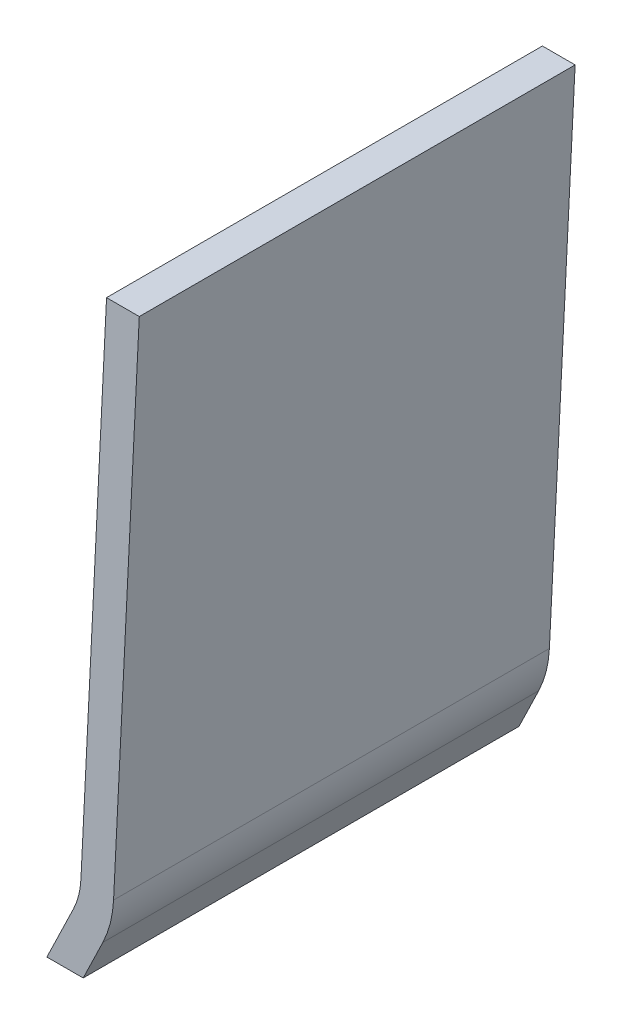
ISO-10303-21;
HEADER;
FILE_DESCRIPTION(('STEP AP214'),'2;1');
FILE_NAME('part.step','',(''),(''),'','','');
FILE_SCHEMA(('AUTOMOTIVE_DESIGN { 1 0 10303 214 1 1 1 1 }'));
ENDSEC;
DATA;
#1=APPLICATION_CONTEXT('core data for automotive mechanical design processes');
#2=APPLICATION_PROTOCOL_DEFINITION('international standard','automotive_design',2000,#1);
#3=PRODUCT_CONTEXT('',#1,'mechanical');
#4=PRODUCT('Part','Part','',(#3));
#5=PRODUCT_RELATED_PRODUCT_CATEGORY('part','',(#4));
#6=PRODUCT_DEFINITION_FORMATION('','',#4);
#7=PRODUCT_DEFINITION_CONTEXT('part definition',#1,'design');
#8=PRODUCT_DEFINITION('design','',#6,#7);
#9=PRODUCT_DEFINITION_SHAPE('','',#8);
#10=(LENGTH_UNIT() NAMED_UNIT(*) SI_UNIT(.MILLI.,.METRE.));
#11=(NAMED_UNIT(*) PLANE_ANGLE_UNIT() SI_UNIT($,.RADIAN.));
#12=(NAMED_UNIT(*) SI_UNIT($,.STERADIAN.) SOLID_ANGLE_UNIT());
#13=UNCERTAINTY_MEASURE_WITH_UNIT(LENGTH_MEASURE(1.E-05),#10,'distance_accuracy_value','');
#14=(GEOMETRIC_REPRESENTATION_CONTEXT(3) GLOBAL_UNCERTAINTY_ASSIGNED_CONTEXT((#13)) GLOBAL_UNIT_ASSIGNED_CONTEXT((#10,
#11,#12)) REPRESENTATION_CONTEXT('',''));
#15=CARTESIAN_POINT('',(0.,0.,0.));
#16=DIRECTION('',(0.,0.,1.));
#17=DIRECTION('',(1.,0.,0.));
#18=AXIS2_PLACEMENT_3D('',#15,#16,#17);
#19=CARTESIAN_POINT('',(537.24518068238,75.8749544468585,400.));
#20=DIRECTION('',(-0.998771350761454,0.0495559168832607,0.));
#21=DIRECTION('',(-0.0495559168832607,-0.998771350761454,0.));
#22=AXIS2_PLACEMENT_3D('',#19,#20,#21);
#23=PLANE('',#22);
#24=DIRECTION('',(0.0495559168832607,0.998771350761454,0.));
#25=VECTOR('',#24,1.);
#26=CARTESIAN_POINT('',(537.24518068238,75.8749544468585,0.));
#27=LINE('',#26,#25);
#28=CARTESIAN_POINT('',(537.24518068238,75.8749544468585,0.));
#29=VERTEX_POINT('',#28);
#30=CARTESIAN_POINT('',(560.843549817296,551.486677506498,0.));
#31=VERTEX_POINT('',#30);
#32=EDGE_CURVE('E140',#29,#31,#27,.T.);
#33=ORIENTED_EDGE('',*,*,#32,.T.);
#34=DIRECTION('',(0.,0.,-1.));
#35=VECTOR('',#34,1.);
#36=CARTESIAN_POINT('',(560.843549817296,551.486677506498,400.));
#37=LINE('',#36,#35);
#38=CARTESIAN_POINT('',(560.843549817296,551.486677506498,400.));
#39=VERTEX_POINT('',#38);
#40=EDGE_CURVE('E11',#39,#31,#37,.T.);
#41=ORIENTED_EDGE('',*,*,#40,.F.);
#42=DIRECTION('',(0.0495559168832607,0.998771350761454,0.));
#43=VECTOR('',#42,1.);
#44=CARTESIAN_POINT('',(537.24518068238,75.8749544468585,400.));
#45=LINE('',#44,#43);
#46=CARTESIAN_POINT('',(537.24518068238,75.8749544468585,400.));
#47=VERTEX_POINT('',#46);
#48=EDGE_CURVE('E162',#47,#39,#45,.T.);
#49=ORIENTED_EDGE('',*,*,#48,.F.);
#50=DIRECTION('',(0.,0.,-1.));
#51=VECTOR('',#50,1.);
#52=CARTESIAN_POINT('',(537.24518068238,75.8749544468585,400.));
#53=LINE('',#52,#51);
#54=EDGE_CURVE('E136',#47,#29,#53,.T.);
#55=ORIENTED_EDGE('',*,*,#54,.T.);
#56=EDGE_LOOP('',(#33,#41,#49,#55));
#57=FACE_BOUND('',#56,.T.);
#58=ADVANCED_FACE('F39',(#57),#23,.F.);
#59=CARTESIAN_POINT('',(530.80664499706,551.486677506498,400.));
#60=DIRECTION('',(0.,-1.,0.));
#61=DIRECTION('',(0.,0.,-1.));
#62=AXIS2_PLACEMENT_3D('',#59,#60,#61);
#63=PLANE('',#62);
#64=DIRECTION('',(-1.,0.,0.));
#65=VECTOR('',#64,1.);
#66=CARTESIAN_POINT('',(530.80664499706,551.486677506498,0.));
#67=LINE('',#66,#65);
#68=CARTESIAN_POINT('',(530.80664499706,551.486677506498,0.));
#69=VERTEX_POINT('',#68);
#70=EDGE_CURVE('E144',#31,#69,#67,.T.);
#71=ORIENTED_EDGE('',*,*,#70,.T.);
#72=DIRECTION('',(0.,0.,-1.));
#73=VECTOR('',#72,1.);
#74=CARTESIAN_POINT('',(530.80664499706,551.486677506498,400.));
#75=LINE('',#74,#73);
#76=CARTESIAN_POINT('',(530.80664499706,551.486677506498,400.));
#77=VERTEX_POINT('',#76);
#78=EDGE_CURVE('E48',#77,#69,#75,.T.);
#79=ORIENTED_EDGE('',*,*,#78,.F.);
#80=DIRECTION('',(-1.,0.,0.));
#81=VECTOR('',#80,1.);
#82=CARTESIAN_POINT('',(530.80664499706,551.486677506498,400.));
#83=LINE('',#82,#81);
#84=EDGE_CURVE('E99',#39,#77,#83,.T.);
#85=ORIENTED_EDGE('',*,*,#84,.F.);
#86=ORIENTED_EDGE('',*,*,#40,.T.);
#87=EDGE_LOOP('',(#71,#79,#85,#86));
#88=FACE_BOUND('',#87,.T.);
#89=ADVANCED_FACE('F208',(#88),#63,.F.);
#90=CARTESIAN_POINT('',(507.282040159536,77.3616319533563,400.));
#91=DIRECTION('',(0.998771350761454,-0.0495559168832607,0.));
#92=DIRECTION('',(0.0495559168832607,0.998771350761454,0.));
#93=AXIS2_PLACEMENT_3D('',#90,#91,#92);
#94=PLANE('',#93);
#95=DIRECTION('',(-0.0495559168832607,-0.998771350761454,0.));
#96=VECTOR('',#95,1.);
#97=CARTESIAN_POINT('',(507.282040159536,77.3616319533563,0.));
#98=LINE('',#97,#96);
#99=CARTESIAN_POINT('',(507.282040159536,77.3616319533563,0.));
#100=VERTEX_POINT('',#99);
#101=EDGE_CURVE('E147',#69,#100,#98,.T.);
#102=ORIENTED_EDGE('',*,*,#101,.T.);
#103=DIRECTION('',(0.,0.,-1.));
#104=VECTOR('',#103,1.);
#105=CARTESIAN_POINT('',(507.282040159536,77.3616319533563,400.));
#106=LINE('',#105,#104);
#107=CARTESIAN_POINT('',(507.282040159536,77.3616319533563,400.));
#108=VERTEX_POINT('',#107);
#109=EDGE_CURVE('E173',#108,#100,#106,.T.);
#110=ORIENTED_EDGE('',*,*,#109,.F.);
#111=DIRECTION('',(-0.0495559168832607,-0.998771350761454,0.));
#112=VECTOR('',#111,1.);
#113=CARTESIAN_POINT('',(507.282040159536,77.3616319533563,400.));
#114=LINE('',#113,#112);
#115=EDGE_CURVE('E183',#77,#108,#114,.T.);
#116=ORIENTED_EDGE('',*,*,#115,.F.);
#117=ORIENTED_EDGE('',*,*,#78,.T.);
#118=EDGE_LOOP('',(#102,#110,#116,#117));
#119=FACE_BOUND('',#118,.T.);
#120=ADVANCED_FACE('F181',(#119),#94,.F.);
#121=CARTESIAN_POINT('',(437.368045606234,80.8305461351842,400.));
#122=DIRECTION('',(0.,0.,-1.));
#123=DIRECTION('',(-1.,0.,0.));
#124=AXIS2_PLACEMENT_3D('',#121,#122,#123);
#125=CYLINDRICAL_SURFACE('',#124,70.);
#126=CARTESIAN_POINT('',(437.368045606234,80.8305461351842,0.));
#127=DIRECTION('',(0.,0.,-1.));
#128=DIRECTION('',(1.,0.,0.));
#129=AXIS2_PLACEMENT_3D('',#126,#127,#128);
#130=CIRCLE('',#129,70.);
#131=CARTESIAN_POINT('',(500.387814031148,50.3591039692765,0.));
#132=VERTEX_POINT('',#131);
#133=EDGE_CURVE('E150',#100,#132,#130,.T.);
#134=ORIENTED_EDGE('',*,*,#133,.T.);
#135=DIRECTION('',(0.,0.,-1.));
#136=VECTOR('',#135,1.);
#137=CARTESIAN_POINT('',(500.387814031148,50.3591039692765,400.));
#138=LINE('',#137,#136);
#139=CARTESIAN_POINT('',(500.387814031148,50.3591039692765,400.));
#140=VERTEX_POINT('',#139);
#141=EDGE_CURVE('E169',#140,#132,#138,.T.);
#142=ORIENTED_EDGE('',*,*,#141,.F.);
#143=CARTESIAN_POINT('',(437.368045606234,80.8305461351842,400.));
#144=DIRECTION('',(0.,0.,-1.));
#145=DIRECTION('',(1.,0.,0.));
#146=AXIS2_PLACEMENT_3D('',#143,#144,#145);
#147=CIRCLE('',#146,70.);
#148=EDGE_CURVE('E196',#108,#140,#147,.T.);
#149=ORIENTED_EDGE('',*,*,#148,.F.);
#150=ORIENTED_EDGE('',*,*,#109,.T.);
#151=EDGE_LOOP('',(#134,#142,#149,#150));
#152=FACE_BOUND('',#151,.T.);
#153=ADVANCED_FACE('F191',(#152),#125,.F.);
#154=CARTESIAN_POINT('',(500.387814031148,50.3591039692764,400.));
#155=DIRECTION('',(0.900282406070196,-0.435306316655821,0.));
#156=DIRECTION('',(0.435306316655821,0.900282406070196,0.));
#157=AXIS2_PLACEMENT_3D('',#154,#155,#156);
#158=PLANE('',#157);
#159=DIRECTION('',(-0.435306316655821,-0.900282406070196,0.));
#160=VECTOR('',#159,1.);
#161=CARTESIAN_POINT('',(500.387814031148,50.3591039692764,0.));
#162=LINE('',#161,#160);
#163=CARTESIAN_POINT('',(476.038081201598,0.,0.));
#164=VERTEX_POINT('',#163);
#165=EDGE_CURVE('E153',#132,#164,#162,.T.);
#166=ORIENTED_EDGE('',*,*,#165,.T.);
#167=DIRECTION('',(0.,0.,-1.));
#168=VECTOR('',#167,1.);
#169=CARTESIAN_POINT('',(476.038081201598,0.,400.));
#170=LINE('',#169,#168);
#171=CARTESIAN_POINT('',(476.038081201598,0.,400.));
#172=VERTEX_POINT('',#171);
#173=EDGE_CURVE('E129',#172,#164,#170,.T.);
#174=ORIENTED_EDGE('',*,*,#173,.F.);
#175=DIRECTION('',(-0.435306316655821,-0.900282406070196,0.));
#176=VECTOR('',#175,1.);
#177=CARTESIAN_POINT('',(500.387814031148,50.3591039692764,400.));
#178=LINE('',#177,#176);
#179=EDGE_CURVE('E118',#140,#172,#178,.T.);
#180=ORIENTED_EDGE('',*,*,#179,.F.);
#181=ORIENTED_EDGE('',*,*,#141,.T.);
#182=EDGE_LOOP('',(#166,#174,#180,#181));
#183=FACE_BOUND('',#182,.T.);
#184=ADVANCED_FACE('F194',(#183),#158,.F.);
#185=CARTESIAN_POINT('',(476.038081201598,0.,400.));
#186=DIRECTION('',(0.,1.,0.));
#187=DIRECTION('',(0.,0.,1.));
#188=AXIS2_PLACEMENT_3D('',#185,#186,#187);
#189=PLANE('',#188);
#190=DIRECTION('',(1.,0.,0.));
#191=VECTOR('',#190,1.);
#192=CARTESIAN_POINT('',(476.038081201598,0.,0.));
#193=LINE('',#192,#191);
#194=CARTESIAN_POINT('',(509.360958331845,0.,0.));
#195=VERTEX_POINT('',#194);
#196=EDGE_CURVE('E127',#164,#195,#193,.T.);
#197=ORIENTED_EDGE('',*,*,#196,.T.);
#198=DIRECTION('',(0.,0.,-1.));
#199=VECTOR('',#198,1.);
#200=CARTESIAN_POINT('',(509.360958331845,0.,400.));
#201=LINE('',#200,#199);
#202=CARTESIAN_POINT('',(509.360958331845,0.,400.));
#203=VERTEX_POINT('',#202);
#204=EDGE_CURVE('E124',#203,#195,#201,.T.);
#205=ORIENTED_EDGE('',*,*,#204,.F.);
#206=DIRECTION('',(1.,0.,0.));
#207=VECTOR('',#206,1.);
#208=CARTESIAN_POINT('',(476.038081201598,0.,400.));
#209=LINE('',#208,#207);
#210=EDGE_CURVE('E112',#172,#203,#209,.T.);
#211=ORIENTED_EDGE('',*,*,#210,.F.);
#212=ORIENTED_EDGE('',*,*,#173,.T.);
#213=EDGE_LOOP('',(#197,#205,#211,#212));
#214=FACE_BOUND('',#213,.T.);
#215=ADVANCED_FACE('F125',(#214),#189,.F.);
#216=CARTESIAN_POINT('',(509.360958331845,0.,400.));
#217=DIRECTION('',(-0.900282406070196,0.435306316655821,0.));
#218=DIRECTION('',(-0.435306316655821,-0.900282406070196,0.));
#219=AXIS2_PLACEMENT_3D('',#216,#217,#218);
#220=PLANE('',#219);
#221=DIRECTION('',(0.435306316655821,0.900282406070196,0.));
#222=VECTOR('',#221,1.);
#223=CARTESIAN_POINT('',(509.360958331845,0.,0.));
#224=LINE('',#223,#222);
#225=CARTESIAN_POINT('',(527.396286213254,37.2999144696018,0.));
#226=VERTEX_POINT('',#225);
#227=EDGE_CURVE('E85',#195,#226,#224,.T.);
#228=ORIENTED_EDGE('',*,*,#227,.T.);
#229=DIRECTION('',(0.,0.,-1.));
#230=VECTOR('',#229,1.);
#231=CARTESIAN_POINT('',(527.396286213254,37.2999144696018,400.));
#232=LINE('',#231,#230);
#233=CARTESIAN_POINT('',(527.396286213254,37.2999144696018,400.));
#234=VERTEX_POINT('',#233);
#235=EDGE_CURVE('E130',#234,#226,#232,.T.);
#236=ORIENTED_EDGE('',*,*,#235,.F.);
#237=DIRECTION('',(0.435306316655821,0.900282406070196,0.));
#238=VECTOR('',#237,1.);
#239=CARTESIAN_POINT('',(509.360958331845,0.,400.));
#240=LINE('',#239,#238);
#241=EDGE_CURVE('E116',#203,#234,#240,.T.);
#242=ORIENTED_EDGE('',*,*,#241,.F.);
#243=ORIENTED_EDGE('',*,*,#204,.T.);
#244=EDGE_LOOP('',(#228,#236,#242,#243));
#245=FACE_BOUND('',#244,.T.);
#246=ADVANCED_FACE('F132',(#245),#220,.F.);
#247=CARTESIAN_POINT('',(437.368045606234,80.8305461351842,400.));
#248=DIRECTION('',(0.,0.,-1.));
#249=DIRECTION('',(-1.,0.,0.));
#250=AXIS2_PLACEMENT_3D('',#247,#248,#249);
#251=CYLINDRICAL_SURFACE('',#250,100.);
#252=CARTESIAN_POINT('',(437.368045606234,80.8305461351842,0.));
#253=DIRECTION('',(0.,0.,1.));
#254=DIRECTION('',(1.,0.,0.));
#255=AXIS2_PLACEMENT_3D('',#252,#253,#254);
#256=CIRCLE('',#255,100.);
#257=EDGE_CURVE('E91',#226,#29,#256,.T.);
#258=ORIENTED_EDGE('',*,*,#257,.T.);
#259=ORIENTED_EDGE('',*,*,#54,.F.);
#260=CARTESIAN_POINT('',(437.368045606234,80.8305461351842,400.));
#261=DIRECTION('',(0.,0.,1.));
#262=DIRECTION('',(1.,0.,0.));
#263=AXIS2_PLACEMENT_3D('',#260,#261,#262);
#264=CIRCLE('',#263,100.);
#265=EDGE_CURVE('E56',#234,#47,#264,.T.);
#266=ORIENTED_EDGE('',*,*,#265,.F.);
#267=ORIENTED_EDGE('',*,*,#235,.T.);
#268=EDGE_LOOP('',(#258,#259,#266,#267));
#269=FACE_BOUND('',#268,.T.);
#270=ADVANCED_FACE('F224',(#269),#251,.T.);
#271=CARTESIAN_POINT('',(437.368045606234,80.8305461351842,400.));
#272=DIRECTION('',(0.,0.,1.));
#273=DIRECTION('',(1.,0.,0.));
#274=AXIS2_PLACEMENT_3D('',#271,#272,#273);
#275=PLANE('',#274);
#276=ORIENTED_EDGE('',*,*,#48,.T.);
#277=ORIENTED_EDGE('',*,*,#84,.T.);
#278=ORIENTED_EDGE('',*,*,#115,.T.);
#279=ORIENTED_EDGE('',*,*,#148,.T.);
#280=ORIENTED_EDGE('',*,*,#179,.T.);
#281=ORIENTED_EDGE('',*,*,#210,.T.);
#282=ORIENTED_EDGE('',*,*,#241,.T.);
#283=ORIENTED_EDGE('',*,*,#265,.T.);
#284=EDGE_LOOP('',(#276,#277,#278,#279,#280,#281,#282,#283));
#285=FACE_BOUND('',#284,.T.);
#286=ADVANCED_FACE('F114',(#285),#275,.T.);
#287=CARTESIAN_POINT('',(437.368045606234,80.8305461351842,0.));
#288=DIRECTION('',(0.,0.,1.));
#289=DIRECTION('',(1.,0.,0.));
#290=AXIS2_PLACEMENT_3D('',#287,#288,#289);
#291=PLANE('',#290);
#292=ORIENTED_EDGE('',*,*,#32,.F.);
#293=ORIENTED_EDGE('',*,*,#257,.F.);
#294=ORIENTED_EDGE('',*,*,#227,.F.);
#295=ORIENTED_EDGE('',*,*,#196,.F.);
#296=ORIENTED_EDGE('',*,*,#165,.F.);
#297=ORIENTED_EDGE('',*,*,#133,.F.);
#298=ORIENTED_EDGE('',*,*,#101,.F.);
#299=ORIENTED_EDGE('',*,*,#70,.F.);
#300=EDGE_LOOP('',(#292,#293,#294,#295,#296,#297,#298,#299));
#301=FACE_BOUND('',#300,.T.);
#302=ADVANCED_FACE('F187',(#301),#291,.F.);
#303=CLOSED_SHELL('',(#58,#89,#120,#153,#184,#215,#246,#270,#286,#302));
#304=MANIFOLD_SOLID_BREP('B2',#303);
#305=ADVANCED_BREP_SHAPE_REPRESENTATION('',(#18,#304),#14);
#306=SHAPE_DEFINITION_REPRESENTATION(#9,#305);
ENDSEC;
END-ISO-10303-21;
